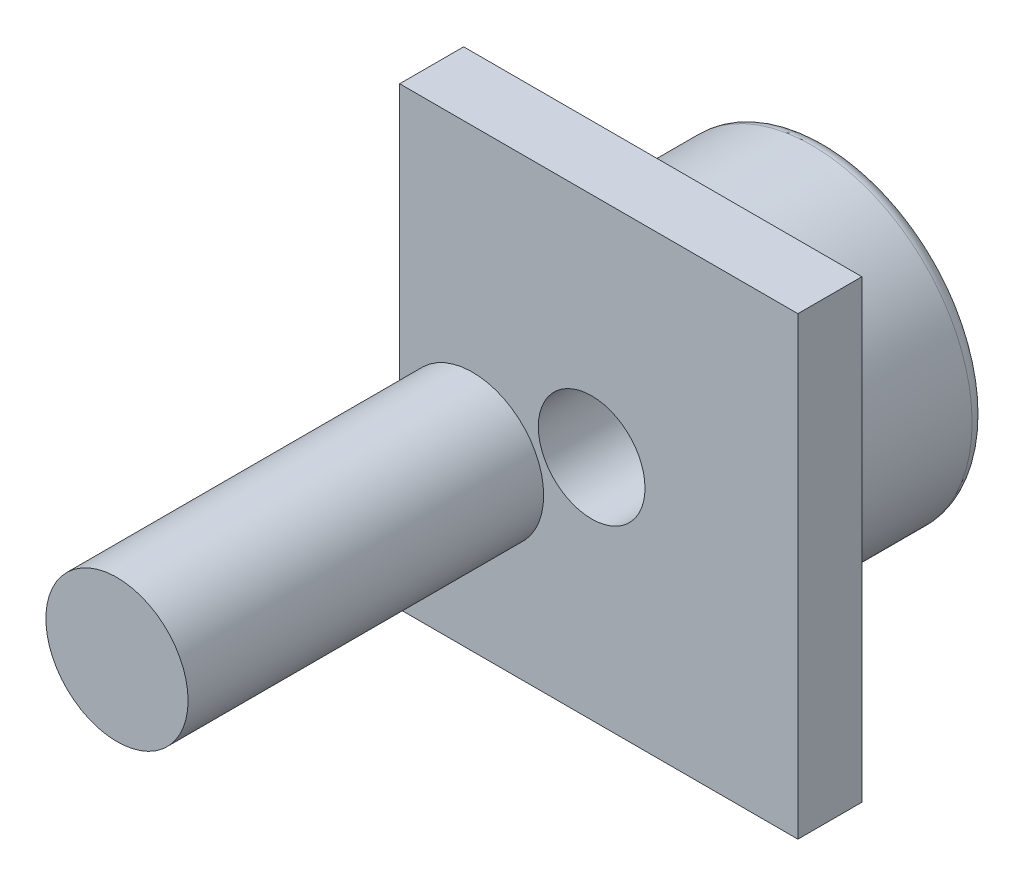
ISO-10303-21;
HEADER;
FILE_DESCRIPTION(('STEP AP214'),'2;1');
FILE_NAME('part.step','',(''),(''),'','','');
FILE_SCHEMA(('AUTOMOTIVE_DESIGN { 1 0 10303 214 1 1 1 1 }'));
ENDSEC;
DATA;
#1=APPLICATION_CONTEXT('core data for automotive mechanical design processes');
#2=APPLICATION_PROTOCOL_DEFINITION('international standard','automotive_design',2000,#1);
#3=PRODUCT_CONTEXT('',#1,'mechanical');
#4=PRODUCT('Part','Part','',(#3));
#5=PRODUCT_RELATED_PRODUCT_CATEGORY('part','',(#4));
#6=PRODUCT_DEFINITION_FORMATION('','',#4);
#7=PRODUCT_DEFINITION_CONTEXT('part definition',#1,'design');
#8=PRODUCT_DEFINITION('design','',#6,#7);
#9=PRODUCT_DEFINITION_SHAPE('','',#8);
#10=(LENGTH_UNIT() NAMED_UNIT(*) SI_UNIT(.MILLI.,.METRE.));
#11=(NAMED_UNIT(*) PLANE_ANGLE_UNIT() SI_UNIT($,.RADIAN.));
#12=(NAMED_UNIT(*) SI_UNIT($,.STERADIAN.) SOLID_ANGLE_UNIT());
#13=UNCERTAINTY_MEASURE_WITH_UNIT(LENGTH_MEASURE(1.E-05),#10,'distance_accuracy_value','');
#14=(GEOMETRIC_REPRESENTATION_CONTEXT(3) GLOBAL_UNCERTAINTY_ASSIGNED_CONTEXT((#13)) GLOBAL_UNIT_ASSIGNED_CONTEXT((#10,
#11,#12)) REPRESENTATION_CONTEXT('',''));
#15=CARTESIAN_POINT('',(0.,0.,0.));
#16=DIRECTION('',(0.,0.,1.));
#17=DIRECTION('',(1.,0.,0.));
#18=AXIS2_PLACEMENT_3D('',#15,#16,#17);
#19=CARTESIAN_POINT('',(0.,0.,4.8));
#20=DIRECTION('',(0.,0.,-1.));
#21=DIRECTION('',(-1.,0.,0.));
#22=AXIS2_PLACEMENT_3D('',#19,#20,#21);
#23=CYLINDRICAL_SURFACE('',#22,4.5);
#24=CARTESIAN_POINT('',(0.,0.,0.4));
#25=DIRECTION('',(0.,0.,1.));
#26=DIRECTION('',(1.,0.,0.));
#27=AXIS2_PLACEMENT_3D('',#24,#25,#26);
#28=CIRCLE('',#27,4.5);
#29=CARTESIAN_POINT('',(4.5,0.,0.4));
#30=VERTEX_POINT('',#29);
#31=EDGE_CURVE('E46',#30,#30,#28,.T.);
#32=ORIENTED_EDGE('',*,*,#31,.T.);
#33=EDGE_LOOP('',(#32));
#34=FACE_BOUND('',#33,.T.);
#35=CARTESIAN_POINT('',(0.,0.,4.8));
#36=DIRECTION('',(0.,0.,1.));
#37=DIRECTION('',(1.,0.,0.));
#38=AXIS2_PLACEMENT_3D('',#35,#36,#37);
#39=CIRCLE('',#38,4.5);
#40=CARTESIAN_POINT('',(4.5,0.,4.8));
#41=VERTEX_POINT('',#40);
#42=EDGE_CURVE('E101',#41,#41,#39,.T.);
#43=ORIENTED_EDGE('',*,*,#42,.F.);
#44=EDGE_LOOP('',(#43));
#45=FACE_BOUND('',#44,.T.);
#46=ADVANCED_FACE('F37',(#34,#45),#23,.T.);
#47=CARTESIAN_POINT('',(0.,0.,0.));
#48=DIRECTION('',(0.,0.,1.));
#49=DIRECTION('',(1.,0.,0.));
#50=AXIS2_PLACEMENT_3D('',#47,#48,#49);
#51=PLANE('',#50);
#52=CARTESIAN_POINT('',(0.,0.,0.));
#53=DIRECTION('',(0.,0.,-1.));
#54=DIRECTION('',(-1.,0.,0.));
#55=AXIS2_PLACEMENT_3D('',#52,#53,#54);
#56=CIRCLE('',#55,3.);
#57=CARTESIAN_POINT('',(-3.,0.,0.));
#58=VERTEX_POINT('',#57);
#59=EDGE_CURVE('E169',#58,#58,#56,.T.);
#60=ORIENTED_EDGE('',*,*,#59,.F.);
#61=EDGE_LOOP('',(#60));
#62=FACE_BOUND('',#61,.T.);
#63=CARTESIAN_POINT('',(0.,0.,0.));
#64=DIRECTION('',(0.,0.,1.));
#65=DIRECTION('',(1.,0.,0.));
#66=AXIS2_PLACEMENT_3D('',#63,#64,#65);
#67=CIRCLE('',#66,4.1);
#68=CARTESIAN_POINT('',(4.1,0.,0.));
#69=VERTEX_POINT('',#68);
#70=EDGE_CURVE('E11',#69,#69,#67,.F.);
#71=ORIENTED_EDGE('',*,*,#70,.T.);
#72=EDGE_LOOP('',(#71));
#73=FACE_BOUND('',#72,.T.);
#74=ADVANCED_FACE('F125',(#62,#73),#51,.F.);
#75=CARTESIAN_POINT('',(-5.4,7.4,6.6));
#76=DIRECTION('',(1.,0.,0.));
#77=DIRECTION('',(0.,1.,0.));
#78=AXIS2_PLACEMENT_3D('',#75,#76,#77);
#79=PLANE('',#78);
#80=DIRECTION('',(0.,-1.,0.));
#81=VECTOR('',#80,1.);
#82=CARTESIAN_POINT('',(-5.4,7.4,6.6));
#83=LINE('',#82,#81);
#84=CARTESIAN_POINT('',(-5.4,6.4,6.6));
#85=VERTEX_POINT('',#84);
#86=CARTESIAN_POINT('',(-5.4,-6.4,6.6));
#87=VERTEX_POINT('',#86);
#88=EDGE_CURVE('E95',#85,#87,#83,.T.);
#89=ORIENTED_EDGE('',*,*,#88,.F.);
#90=DIRECTION('',(0.,0.,1.));
#91=VECTOR('',#90,1.);
#92=CARTESIAN_POINT('',(-5.4,6.4,4.6));
#93=LINE('',#92,#91);
#94=CARTESIAN_POINT('',(-5.4,6.4,4.8));
#95=VERTEX_POINT('',#94);
#96=EDGE_CURVE('E178',#95,#85,#93,.T.);
#97=ORIENTED_EDGE('',*,*,#96,.F.);
#98=DIRECTION('',(0.,-1.,0.));
#99=VECTOR('',#98,1.);
#100=CARTESIAN_POINT('',(-5.4,7.4,4.8));
#101=LINE('',#100,#99);
#102=CARTESIAN_POINT('',(-5.4,-6.4,4.8));
#103=VERTEX_POINT('',#102);
#104=EDGE_CURVE('E86',#95,#103,#101,.T.);
#105=ORIENTED_EDGE('',*,*,#104,.T.);
#106=DIRECTION('',(0.,0.,-1.));
#107=VECTOR('',#106,1.);
#108=CARTESIAN_POINT('',(-5.4,-6.4,6.6));
#109=LINE('',#108,#107);
#110=EDGE_CURVE('E81',#87,#103,#109,.T.);
#111=ORIENTED_EDGE('',*,*,#110,.F.);
#112=EDGE_LOOP('',(#89,#97,#105,#111));
#113=FACE_BOUND('',#112,.T.);
#114=ADVANCED_FACE('F129',(#113),#79,.F.);
#115=CARTESIAN_POINT('',(-5.4,-6.4,6.6));
#116=DIRECTION('',(0.,1.,0.));
#117=DIRECTION('',(0.,0.,1.));
#118=AXIS2_PLACEMENT_3D('',#115,#116,#117);
#119=PLANE('',#118);
#120=DIRECTION('',(1.,0.,0.));
#121=VECTOR('',#120,1.);
#122=CARTESIAN_POINT('',(-5.4,-6.4,4.8));
#123=LINE('',#122,#121);
#124=CARTESIAN_POINT('',(5.8,-6.4,4.8));
#125=VERTEX_POINT('',#124);
#126=EDGE_CURVE('E75',#103,#125,#123,.T.);
#127=ORIENTED_EDGE('',*,*,#126,.T.);
#128=DIRECTION('',(0.,0.,-1.));
#129=VECTOR('',#128,1.);
#130=CARTESIAN_POINT('',(5.8,-6.4,6.6));
#131=LINE('',#130,#129);
#132=CARTESIAN_POINT('',(5.8,-6.4,6.6));
#133=VERTEX_POINT('',#132);
#134=EDGE_CURVE('E78',#133,#125,#131,.T.);
#135=ORIENTED_EDGE('',*,*,#134,.F.);
#136=DIRECTION('',(1.,0.,0.));
#137=VECTOR('',#136,1.);
#138=CARTESIAN_POINT('',(-5.4,-6.4,6.6));
#139=LINE('',#138,#137);
#140=EDGE_CURVE('E62',#87,#133,#139,.T.);
#141=ORIENTED_EDGE('',*,*,#140,.F.);
#142=ORIENTED_EDGE('',*,*,#110,.T.);
#143=EDGE_LOOP('',(#127,#135,#141,#142));
#144=FACE_BOUND('',#143,.T.);
#145=ADVANCED_FACE('F77',(#144),#119,.F.);
#146=CARTESIAN_POINT('',(5.8,7.4,6.6));
#147=DIRECTION('',(-1.,0.,0.));
#148=DIRECTION('',(0.,-1.,0.));
#149=AXIS2_PLACEMENT_3D('',#146,#147,#148);
#150=PLANE('',#149);
#151=DIRECTION('',(0.,1.,0.));
#152=VECTOR('',#151,1.);
#153=CARTESIAN_POINT('',(5.8,7.4,4.8));
#154=LINE('',#153,#152);
#155=CARTESIAN_POINT('',(5.8,6.4,4.8));
#156=VERTEX_POINT('',#155);
#157=EDGE_CURVE('E85',#125,#156,#154,.T.);
#158=ORIENTED_EDGE('',*,*,#157,.T.);
#159=DIRECTION('',(0.,0.,1.));
#160=VECTOR('',#159,1.);
#161=CARTESIAN_POINT('',(5.8,6.4,4.6));
#162=LINE('',#161,#160);
#163=CARTESIAN_POINT('',(5.8,6.4,6.6));
#164=VERTEX_POINT('',#163);
#165=EDGE_CURVE('E53',#156,#164,#162,.T.);
#166=ORIENTED_EDGE('',*,*,#165,.T.);
#167=DIRECTION('',(0.,1.,0.));
#168=VECTOR('',#167,1.);
#169=CARTESIAN_POINT('',(5.8,7.4,6.6));
#170=LINE('',#169,#168);
#171=EDGE_CURVE('E91',#133,#164,#170,.T.);
#172=ORIENTED_EDGE('',*,*,#171,.F.);
#173=ORIENTED_EDGE('',*,*,#134,.T.);
#174=EDGE_LOOP('',(#158,#166,#172,#173));
#175=FACE_BOUND('',#174,.T.);
#176=ADVANCED_FACE('F90',(#175),#150,.F.);
#177=CARTESIAN_POINT('',(0.,0.,6.6));
#178=DIRECTION('',(0.,0.,1.));
#179=DIRECTION('',(1.,0.,0.));
#180=AXIS2_PLACEMENT_3D('',#177,#178,#179);
#181=PLANE('',#180);
#182=CARTESIAN_POINT('',(0.,0.,6.6));
#183=DIRECTION('',(0.,0.,1.));
#184=DIRECTION('',(1.,0.,0.));
#185=AXIS2_PLACEMENT_3D('',#182,#183,#184);
#186=CIRCLE('',#185,1.5);
#187=CARTESIAN_POINT('',(1.5,0.,6.6));
#188=VERTEX_POINT('',#187);
#189=EDGE_CURVE('E41',#188,#188,#186,.T.);
#190=ORIENTED_EDGE('',*,*,#189,.F.);
#191=EDGE_LOOP('',(#190));
#192=FACE_BOUND('',#191,.T.);
#193=DIRECTION('',(1.,0.,0.));
#194=VECTOR('',#193,1.);
#195=CARTESIAN_POINT('',(-5.4,6.4,6.6));
#196=LINE('',#195,#194);
#197=EDGE_CURVE('E174',#85,#164,#196,.T.);
#198=ORIENTED_EDGE('',*,*,#197,.F.);
#199=ORIENTED_EDGE('',*,*,#88,.T.);
#200=ORIENTED_EDGE('',*,*,#140,.T.);
#201=ORIENTED_EDGE('',*,*,#171,.T.);
#202=EDGE_LOOP('',(#198,#199,#200,#201));
#203=FACE_BOUND('',#202,.T.);
#204=CARTESIAN_POINT('',(-3.35,-1.6,6.6));
#205=DIRECTION('',(0.,0.,1.));
#206=DIRECTION('',(1.,0.,0.));
#207=AXIS2_PLACEMENT_3D('',#204,#205,#206);
#208=CIRCLE('',#207,2.);
#209=CARTESIAN_POINT('',(-1.35,-1.6,6.6));
#210=VERTEX_POINT('',#209);
#211=EDGE_CURVE('E180',#210,#210,#208,.T.);
#212=ORIENTED_EDGE('',*,*,#211,.F.);
#213=EDGE_LOOP('',(#212));
#214=FACE_BOUND('',#213,.T.);
#215=ADVANCED_FACE('F140',(#192,#203,#214),#181,.T.);
#216=CARTESIAN_POINT('',(0.,0.,4.8));
#217=DIRECTION('',(0.,0.,1.));
#218=DIRECTION('',(1.,0.,0.));
#219=AXIS2_PLACEMENT_3D('',#216,#217,#218);
#220=PLANE('',#219);
#221=ORIENTED_EDGE('',*,*,#42,.T.);
#222=EDGE_LOOP('',(#221));
#223=FACE_BOUND('',#222,.T.);
#224=ORIENTED_EDGE('',*,*,#104,.F.);
#225=DIRECTION('',(1.,0.,0.));
#226=VECTOR('',#225,1.);
#227=CARTESIAN_POINT('',(0.,6.4,4.8));
#228=LINE('',#227,#226);
#229=EDGE_CURVE('E94',#95,#156,#228,.T.);
#230=ORIENTED_EDGE('',*,*,#229,.T.);
#231=ORIENTED_EDGE('',*,*,#157,.F.);
#232=ORIENTED_EDGE('',*,*,#126,.F.);
#233=EDGE_LOOP('',(#224,#230,#231,#232));
#234=FACE_BOUND('',#233,.T.);
#235=ADVANCED_FACE('F93',(#223,#234),#220,.F.);
#236=CARTESIAN_POINT('',(-3.35,-1.6,16.6));
#237=DIRECTION('',(0.,0.,-1.));
#238=DIRECTION('',(-1.,0.,0.));
#239=AXIS2_PLACEMENT_3D('',#236,#237,#238);
#240=CYLINDRICAL_SURFACE('',#239,2.);
#241=CARTESIAN_POINT('',(-3.35,-1.6,16.6));
#242=DIRECTION('',(0.,0.,1.));
#243=DIRECTION('',(1.,0.,0.));
#244=AXIS2_PLACEMENT_3D('',#241,#242,#243);
#245=CIRCLE('',#244,2.);
#246=CARTESIAN_POINT('',(-1.35,-1.6,16.6));
#247=VERTEX_POINT('',#246);
#248=EDGE_CURVE('E183',#247,#247,#245,.T.);
#249=ORIENTED_EDGE('',*,*,#248,.F.);
#250=EDGE_LOOP('',(#249));
#251=FACE_BOUND('',#250,.T.);
#252=ORIENTED_EDGE('',*,*,#211,.T.);
#253=EDGE_LOOP('',(#252));
#254=FACE_BOUND('',#253,.T.);
#255=ADVANCED_FACE('F143',(#251,#254),#240,.T.);
#256=CARTESIAN_POINT('',(-3.35,-1.6,16.6));
#257=DIRECTION('',(0.,0.,1.));
#258=DIRECTION('',(1.,0.,0.));
#259=AXIS2_PLACEMENT_3D('',#256,#257,#258);
#260=PLANE('',#259);
#261=ORIENTED_EDGE('',*,*,#248,.T.);
#262=EDGE_LOOP('',(#261));
#263=FACE_BOUND('',#262,.T.);
#264=ADVANCED_FACE('F121',(#263),#260,.T.);
#265=CARTESIAN_POINT('',(-5.4,6.4,4.6));
#266=DIRECTION('',(0.,-1.,0.));
#267=DIRECTION('',(0.,0.,-1.));
#268=AXIS2_PLACEMENT_3D('',#265,#266,#267);
#269=PLANE('',#268);
#270=ORIENTED_EDGE('',*,*,#96,.T.);
#271=ORIENTED_EDGE('',*,*,#197,.T.);
#272=ORIENTED_EDGE('',*,*,#165,.F.);
#273=ORIENTED_EDGE('',*,*,#229,.F.);
#274=EDGE_LOOP('',(#270,#271,#272,#273));
#275=FACE_BOUND('',#274,.T.);
#276=ADVANCED_FACE('F112',(#275),#269,.F.);
#277=CARTESIAN_POINT('',(0.,0.,0.4));
#278=DIRECTION('',(0.,0.,1.));
#279=DIRECTION('',(1.,0.,0.));
#280=AXIS2_PLACEMENT_3D('',#277,#278,#279);
#281=TOROIDAL_SURFACE('',#280,4.1,0.4);
#282=ORIENTED_EDGE('',*,*,#70,.F.);
#283=EDGE_LOOP('',(#282));
#284=FACE_BOUND('',#283,.T.);
#285=ORIENTED_EDGE('',*,*,#31,.F.);
#286=EDGE_LOOP('',(#285));
#287=FACE_BOUND('',#286,.T.);
#288=ADVANCED_FACE('F39',(#284,#287),#281,.T.);
#289=CARTESIAN_POINT('',(0.,0.,4.));
#290=DIRECTION('',(0.,0.,-1.));
#291=DIRECTION('',(-1.,0.,0.));
#292=AXIS2_PLACEMENT_3D('',#289,#290,#291);
#293=CYLINDRICAL_SURFACE('',#292,3.);
#294=CARTESIAN_POINT('',(0.,0.,4.));
#295=DIRECTION('',(0.,0.,-1.));
#296=DIRECTION('',(-1.,0.,0.));
#297=AXIS2_PLACEMENT_3D('',#294,#295,#296);
#298=CIRCLE('',#297,3.);
#299=CARTESIAN_POINT('',(-3.,0.,4.));
#300=VERTEX_POINT('',#299);
#301=EDGE_CURVE('E171',#300,#300,#298,.T.);
#302=ORIENTED_EDGE('',*,*,#301,.F.);
#303=EDGE_LOOP('',(#302));
#304=FACE_BOUND('',#303,.T.);
#305=ORIENTED_EDGE('',*,*,#59,.T.);
#306=EDGE_LOOP('',(#305));
#307=FACE_BOUND('',#306,.T.);
#308=ADVANCED_FACE('F111',(#304,#307),#293,.F.);
#309=CARTESIAN_POINT('',(0.,0.,4.));
#310=DIRECTION('',(0.,0.,-1.));
#311=DIRECTION('',(-1.,0.,0.));
#312=AXIS2_PLACEMENT_3D('',#309,#310,#311);
#313=PLANE('',#312);
#314=CARTESIAN_POINT('',(0.,0.,4.));
#315=DIRECTION('',(0.,0.,-1.));
#316=DIRECTION('',(-1.,0.,0.));
#317=AXIS2_PLACEMENT_3D('',#314,#315,#316);
#318=CIRCLE('',#317,1.5);
#319=CARTESIAN_POINT('',(-1.5,0.,4.));
#320=VERTEX_POINT('',#319);
#321=EDGE_CURVE('E167',#320,#320,#318,.T.);
#322=ORIENTED_EDGE('',*,*,#321,.F.);
#323=EDGE_LOOP('',(#322));
#324=FACE_BOUND('',#323,.T.);
#325=ORIENTED_EDGE('',*,*,#301,.T.);
#326=EDGE_LOOP('',(#325));
#327=FACE_BOUND('',#326,.T.);
#328=ADVANCED_FACE('F118',(#324,#327),#313,.T.);
#329=CARTESIAN_POINT('',(0.,0.,16.6));
#330=DIRECTION('',(0.,0.,-1.));
#331=DIRECTION('',(-1.,0.,0.));
#332=AXIS2_PLACEMENT_3D('',#329,#330,#331);
#333=CYLINDRICAL_SURFACE('',#332,1.5);
#334=ORIENTED_EDGE('',*,*,#189,.T.);
#335=EDGE_LOOP('',(#334));
#336=FACE_BOUND('',#335,.T.);
#337=ORIENTED_EDGE('',*,*,#321,.T.);
#338=EDGE_LOOP('',(#337));
#339=FACE_BOUND('',#338,.T.);
#340=ADVANCED_FACE('F156',(#336,#339),#333,.F.);
#341=CLOSED_SHELL('',(#46,#74,#114,#145,#176,#215,#235,#255,#264,#276,#288,#308,#328,#340));
#342=MANIFOLD_SOLID_BREP('B2',#341);
#343=ADVANCED_BREP_SHAPE_REPRESENTATION('',(#18,#342),#14);
#344=SHAPE_DEFINITION_REPRESENTATION(#9,#343);
ENDSEC;
END-ISO-10303-21;
